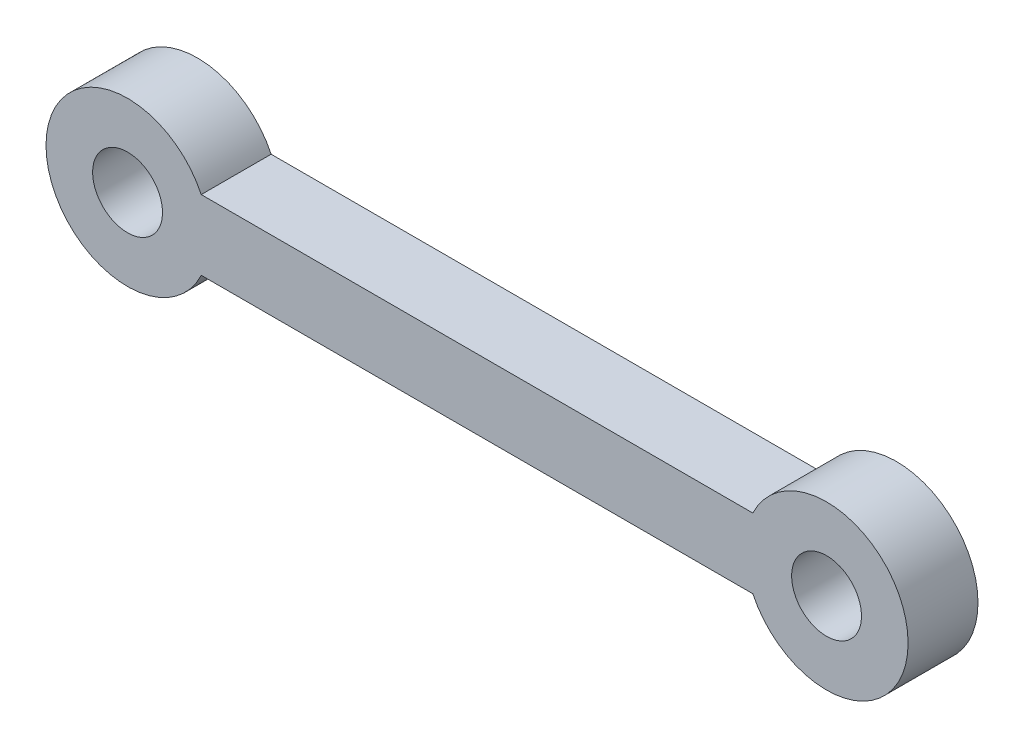
ISO-10303-21;
HEADER;
FILE_DESCRIPTION(('STEP AP214'),'2;1');
FILE_NAME('part.step','',(''),(''),'','','');
FILE_SCHEMA(('AUTOMOTIVE_DESIGN { 1 0 10303 214 1 1 1 1 }'));
ENDSEC;
DATA;
#1=APPLICATION_CONTEXT('core data for automotive mechanical design processes');
#2=APPLICATION_PROTOCOL_DEFINITION('international standard','automotive_design',2000,#1);
#3=PRODUCT_CONTEXT('',#1,'mechanical');
#4=PRODUCT('Part','Part','',(#3));
#5=PRODUCT_RELATED_PRODUCT_CATEGORY('part','',(#4));
#6=PRODUCT_DEFINITION_FORMATION('','',#4);
#7=PRODUCT_DEFINITION_CONTEXT('part definition',#1,'design');
#8=PRODUCT_DEFINITION('design','',#6,#7);
#9=PRODUCT_DEFINITION_SHAPE('','',#8);
#10=(LENGTH_UNIT() NAMED_UNIT(*) SI_UNIT(.MILLI.,.METRE.));
#11=(NAMED_UNIT(*) PLANE_ANGLE_UNIT() SI_UNIT($,.RADIAN.));
#12=(NAMED_UNIT(*) SI_UNIT($,.STERADIAN.) SOLID_ANGLE_UNIT());
#13=UNCERTAINTY_MEASURE_WITH_UNIT(LENGTH_MEASURE(1.E-05),#10,'distance_accuracy_value','');
#14=(GEOMETRIC_REPRESENTATION_CONTEXT(3) GLOBAL_UNCERTAINTY_ASSIGNED_CONTEXT((#13)) GLOBAL_UNIT_ASSIGNED_CONTEXT((#10,
#11,#12)) REPRESENTATION_CONTEXT('',''));
#15=CARTESIAN_POINT('',(0.,0.,0.));
#16=DIRECTION('',(0.,0.,1.));
#17=DIRECTION('',(1.,0.,0.));
#18=AXIS2_PLACEMENT_3D('',#15,#16,#17);
#19=CARTESIAN_POINT('',(0.,0.,0.));
#20=DIRECTION('',(0.,0.,1.));
#21=DIRECTION('',(1.,0.,0.));
#22=AXIS2_PLACEMENT_3D('',#19,#20,#21);
#23=PLANE('',#22);
#24=CARTESIAN_POINT('',(30.,0.,0.));
#25=DIRECTION('',(0.,0.,-1.));
#26=DIRECTION('',(-1.,0.,0.));
#27=AXIS2_PLACEMENT_3D('',#24,#25,#26);
#28=CIRCLE('',#27,1.50000000000001);
#29=CARTESIAN_POINT('',(28.5,0.,0.));
#30=VERTEX_POINT('',#29);
#31=EDGE_CURVE('E83',#30,#30,#28,.F.);
#32=ORIENTED_EDGE('',*,*,#31,.T.);
#33=EDGE_LOOP('',(#32));
#34=FACE_BOUND('',#33,.T.);
#35=DIRECTION('',(1.,0.,0.));
#36=VECTOR('',#35,1.);
#37=CARTESIAN_POINT('',(3.16227766016838,1.5,0.));
#38=LINE('',#37,#36);
#39=CARTESIAN_POINT('',(3.16227766016838,1.5,0.));
#40=VERTEX_POINT('',#39);
#41=CARTESIAN_POINT('',(26.8377223398316,1.5,0.));
#42=VERTEX_POINT('',#41);
#43=EDGE_CURVE('E82',#40,#42,#38,.T.);
#44=ORIENTED_EDGE('',*,*,#43,.T.);
#45=CARTESIAN_POINT('',(30.,0.,0.));
#46=DIRECTION('',(0.,0.,-1.));
#47=DIRECTION('',(-1.,0.,0.));
#48=AXIS2_PLACEMENT_3D('',#45,#46,#47);
#49=CIRCLE('',#48,3.5);
#50=CARTESIAN_POINT('',(26.8377223398316,-1.5,0.));
#51=VERTEX_POINT('',#50);
#52=EDGE_CURVE('E70',#51,#42,#49,.F.);
#53=ORIENTED_EDGE('',*,*,#52,.F.);
#54=DIRECTION('',(1.,0.,0.));
#55=VECTOR('',#54,1.);
#56=CARTESIAN_POINT('',(3.16227766016838,-1.5,0.));
#57=LINE('',#56,#55);
#58=CARTESIAN_POINT('',(3.16227766016838,-1.5,0.));
#59=VERTEX_POINT('',#58);
#60=EDGE_CURVE('E68',#51,#59,#57,.F.);
#61=ORIENTED_EDGE('',*,*,#60,.T.);
#62=CARTESIAN_POINT('',(0.,0.,0.));
#63=DIRECTION('',(0.,0.,-1.));
#64=DIRECTION('',(-1.,0.,0.));
#65=AXIS2_PLACEMENT_3D('',#62,#63,#64);
#66=CIRCLE('',#65,3.5);
#67=EDGE_CURVE('E56',#40,#59,#66,.F.);
#68=ORIENTED_EDGE('',*,*,#67,.F.);
#69=EDGE_LOOP('',(#44,#53,#61,#68));
#70=FACE_BOUND('',#69,.T.);
#71=CARTESIAN_POINT('',(0.,0.,0.));
#72=DIRECTION('',(0.,0.,-1.));
#73=DIRECTION('',(-1.,0.,0.));
#74=AXIS2_PLACEMENT_3D('',#71,#72,#73);
#75=CIRCLE('',#74,1.5);
#76=CARTESIAN_POINT('',(-1.5,0.,0.));
#77=VERTEX_POINT('',#76);
#78=EDGE_CURVE('E20',#77,#77,#75,.F.);
#79=ORIENTED_EDGE('',*,*,#78,.T.);
#80=EDGE_LOOP('',(#79));
#81=FACE_BOUND('',#80,.T.);
#82=ADVANCED_FACE('F17',(#34,#70,#81),#23,.F.);
#83=CARTESIAN_POINT('',(0.,0.,3.));
#84=DIRECTION('',(0.,0.,-1.));
#85=DIRECTION('',(-1.,0.,0.));
#86=AXIS2_PLACEMENT_3D('',#83,#84,#85);
#87=CYLINDRICAL_SURFACE('',#86,1.5);
#88=CARTESIAN_POINT('',(0.,0.,3.));
#89=DIRECTION('',(0.,0.,-1.));
#90=DIRECTION('',(-1.,0.,0.));
#91=AXIS2_PLACEMENT_3D('',#88,#89,#90);
#92=CIRCLE('',#91,1.5);
#93=CARTESIAN_POINT('',(-1.5,0.,3.));
#94=VERTEX_POINT('',#93);
#95=EDGE_CURVE('E90',#94,#94,#92,.T.);
#96=ORIENTED_EDGE('',*,*,#95,.F.);
#97=EDGE_LOOP('',(#96));
#98=FACE_BOUND('',#97,.T.);
#99=ORIENTED_EDGE('',*,*,#78,.F.);
#100=EDGE_LOOP('',(#99));
#101=FACE_BOUND('',#100,.T.);
#102=ADVANCED_FACE('F126',(#98,#101),#87,.F.);
#103=CARTESIAN_POINT('',(0.,0.,3.));
#104=DIRECTION('',(0.,0.,-1.));
#105=DIRECTION('',(-1.,0.,0.));
#106=AXIS2_PLACEMENT_3D('',#103,#104,#105);
#107=CYLINDRICAL_SURFACE('',#106,3.5);
#108=ORIENTED_EDGE('',*,*,#67,.T.);
#109=DIRECTION('',(0.,0.,1.));
#110=VECTOR('',#109,1.);
#111=CARTESIAN_POINT('',(3.16227766016838,-1.5,3.));
#112=LINE('',#111,#110);
#113=CARTESIAN_POINT('',(3.16227766016838,-1.5,3.));
#114=VERTEX_POINT('',#113);
#115=EDGE_CURVE('E60',#59,#114,#112,.T.);
#116=ORIENTED_EDGE('',*,*,#115,.T.);
#117=CARTESIAN_POINT('',(0.,0.,3.));
#118=DIRECTION('',(0.,0.,-1.));
#119=DIRECTION('',(-1.,0.,0.));
#120=AXIS2_PLACEMENT_3D('',#117,#118,#119);
#121=CIRCLE('',#120,3.5);
#122=CARTESIAN_POINT('',(3.16227766016838,1.5,3.));
#123=VERTEX_POINT('',#122);
#124=EDGE_CURVE('E88',#123,#114,#121,.F.);
#125=ORIENTED_EDGE('',*,*,#124,.F.);
#126=DIRECTION('',(0.,0.,-1.));
#127=VECTOR('',#126,1.);
#128=CARTESIAN_POINT('',(3.16227766016838,1.5,3.));
#129=LINE('',#128,#127);
#130=EDGE_CURVE('E63',#123,#40,#129,.T.);
#131=ORIENTED_EDGE('',*,*,#130,.T.);
#132=EDGE_LOOP('',(#108,#116,#125,#131));
#133=FACE_BOUND('',#132,.T.);
#134=ADVANCED_FACE('F58',(#133),#107,.T.);
#135=CARTESIAN_POINT('',(3.16227766016838,-1.5,3.));
#136=DIRECTION('',(0.,1.,0.));
#137=DIRECTION('',(0.,0.,1.));
#138=AXIS2_PLACEMENT_3D('',#135,#136,#137);
#139=PLANE('',#138);
#140=DIRECTION('',(0.,0.,-1.));
#141=VECTOR('',#140,1.);
#142=CARTESIAN_POINT('',(26.8377223398316,-1.5,3.));
#143=LINE('',#142,#141);
#144=CARTESIAN_POINT('',(26.8377223398316,-1.5,3.));
#145=VERTEX_POINT('',#144);
#146=EDGE_CURVE('E80',#145,#51,#143,.T.);
#147=ORIENTED_EDGE('',*,*,#146,.F.);
#148=DIRECTION('',(1.,0.,0.));
#149=VECTOR('',#148,1.);
#150=CARTESIAN_POINT('',(0.,-1.5,3.));
#151=LINE('',#150,#149);
#152=EDGE_CURVE('E76',#114,#145,#151,.T.);
#153=ORIENTED_EDGE('',*,*,#152,.F.);
#154=ORIENTED_EDGE('',*,*,#115,.F.);
#155=ORIENTED_EDGE('',*,*,#60,.F.);
#156=EDGE_LOOP('',(#147,#153,#154,#155));
#157=FACE_BOUND('',#156,.T.);
#158=ADVANCED_FACE('F74',(#157),#139,.F.);
#159=CARTESIAN_POINT('',(30.,0.,3.));
#160=DIRECTION('',(0.,0.,-1.));
#161=DIRECTION('',(-1.,0.,0.));
#162=AXIS2_PLACEMENT_3D('',#159,#160,#161);
#163=CYLINDRICAL_SURFACE('',#162,3.5);
#164=CARTESIAN_POINT('',(30.,0.,3.));
#165=DIRECTION('',(0.,0.,-1.));
#166=DIRECTION('',(-1.,0.,0.));
#167=AXIS2_PLACEMENT_3D('',#164,#165,#166);
#168=CIRCLE('',#167,3.5);
#169=CARTESIAN_POINT('',(26.8377223398316,1.5,3.));
#170=VERTEX_POINT('',#169);
#171=EDGE_CURVE('E85',#145,#170,#168,.F.);
#172=ORIENTED_EDGE('',*,*,#171,.F.);
#173=ORIENTED_EDGE('',*,*,#146,.T.);
#174=ORIENTED_EDGE('',*,*,#52,.T.);
#175=DIRECTION('',(0.,0.,-1.));
#176=VECTOR('',#175,1.);
#177=CARTESIAN_POINT('',(26.8377223398316,1.5,3.));
#178=LINE('',#177,#176);
#179=EDGE_CURVE('E35',#42,#170,#178,.F.);
#180=ORIENTED_EDGE('',*,*,#179,.T.);
#181=EDGE_LOOP('',(#172,#173,#174,#180));
#182=FACE_BOUND('',#181,.T.);
#183=ADVANCED_FACE('F106',(#182),#163,.T.);
#184=CARTESIAN_POINT('',(3.16227766016838,1.5,3.));
#185=DIRECTION('',(0.,-1.,0.));
#186=DIRECTION('',(0.,0.,-1.));
#187=AXIS2_PLACEMENT_3D('',#184,#185,#186);
#188=PLANE('',#187);
#189=ORIENTED_EDGE('',*,*,#130,.F.);
#190=DIRECTION('',(1.,0.,0.));
#191=VECTOR('',#190,1.);
#192=CARTESIAN_POINT('',(0.,1.5,3.));
#193=LINE('',#192,#191);
#194=EDGE_CURVE('E26',#170,#123,#193,.F.);
#195=ORIENTED_EDGE('',*,*,#194,.F.);
#196=ORIENTED_EDGE('',*,*,#179,.F.);
#197=ORIENTED_EDGE('',*,*,#43,.F.);
#198=EDGE_LOOP('',(#189,#195,#196,#197));
#199=FACE_BOUND('',#198,.T.);
#200=ADVANCED_FACE('F103',(#199),#188,.F.);
#201=CARTESIAN_POINT('',(30.,0.,3.));
#202=DIRECTION('',(0.,0.,-1.));
#203=DIRECTION('',(-1.,0.,0.));
#204=AXIS2_PLACEMENT_3D('',#201,#202,#203);
#205=CYLINDRICAL_SURFACE('',#204,1.50000000000001);
#206=CARTESIAN_POINT('',(30.,0.,3.));
#207=DIRECTION('',(0.,0.,-1.));
#208=DIRECTION('',(-1.,0.,0.));
#209=AXIS2_PLACEMENT_3D('',#206,#207,#208);
#210=CIRCLE('',#209,1.50000000000001);
#211=CARTESIAN_POINT('',(28.5,0.,3.));
#212=VERTEX_POINT('',#211);
#213=EDGE_CURVE('E11',#212,#212,#210,.T.);
#214=ORIENTED_EDGE('',*,*,#213,.F.);
#215=EDGE_LOOP('',(#214));
#216=FACE_BOUND('',#215,.T.);
#217=ORIENTED_EDGE('',*,*,#31,.F.);
#218=EDGE_LOOP('',(#217));
#219=FACE_BOUND('',#218,.T.);
#220=ADVANCED_FACE('F105',(#216,#219),#205,.F.);
#221=CARTESIAN_POINT('',(0.,0.,3.));
#222=DIRECTION('',(0.,0.,1.));
#223=DIRECTION('',(1.,0.,0.));
#224=AXIS2_PLACEMENT_3D('',#221,#222,#223);
#225=PLANE('',#224);
#226=ORIENTED_EDGE('',*,*,#213,.T.);
#227=EDGE_LOOP('',(#226));
#228=FACE_BOUND('',#227,.T.);
#229=ORIENTED_EDGE('',*,*,#171,.T.);
#230=ORIENTED_EDGE('',*,*,#194,.T.);
#231=ORIENTED_EDGE('',*,*,#124,.T.);
#232=ORIENTED_EDGE('',*,*,#152,.T.);
#233=EDGE_LOOP('',(#229,#230,#231,#232));
#234=FACE_BOUND('',#233,.T.);
#235=ORIENTED_EDGE('',*,*,#95,.T.);
#236=EDGE_LOOP('',(#235));
#237=FACE_BOUND('',#236,.T.);
#238=ADVANCED_FACE('F100',(#228,#234,#237),#225,.T.);
#239=CLOSED_SHELL('',(#82,#102,#134,#158,#183,#200,#220,#238));
#240=MANIFOLD_SOLID_BREP('B1',#239);
#241=ADVANCED_BREP_SHAPE_REPRESENTATION('',(#18,#240),#14);
#242=SHAPE_DEFINITION_REPRESENTATION(#9,#241);
ENDSEC;
END-ISO-10303-21;
